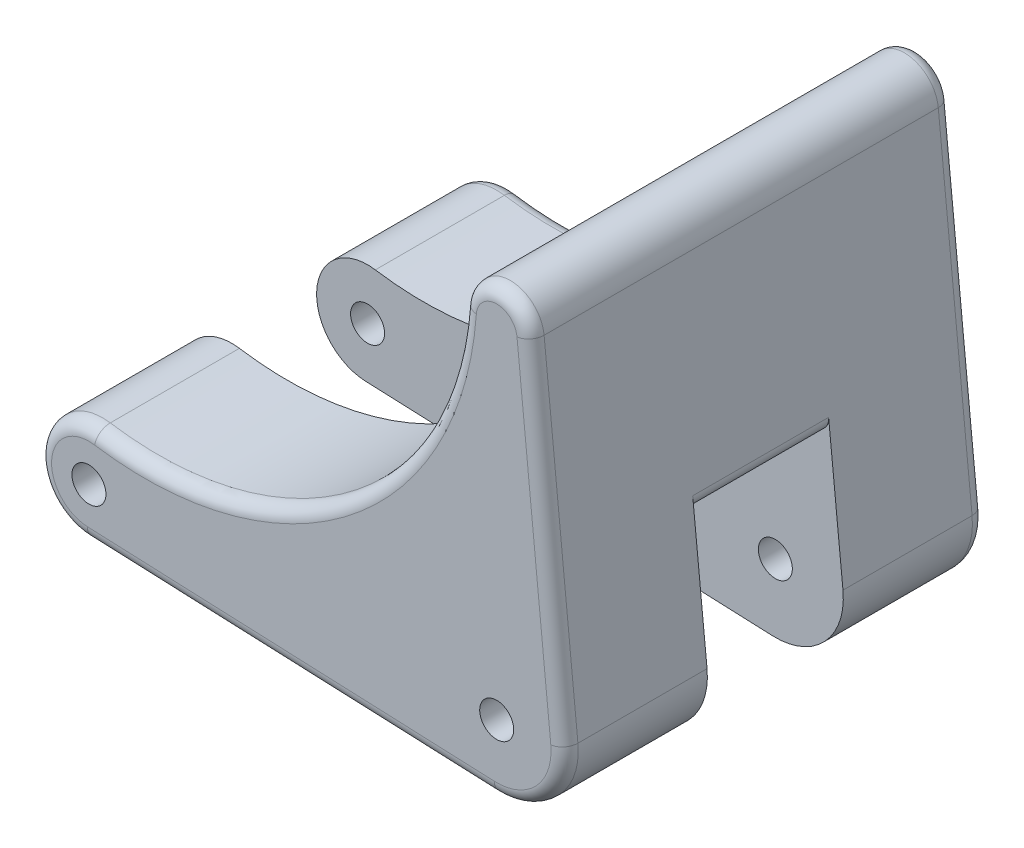
ISO-10303-21;
HEADER;
FILE_DESCRIPTION(('STEP AP214'),'2;1');
FILE_NAME('part.step','',(''),(''),'','','');
FILE_SCHEMA(('AUTOMOTIVE_DESIGN { 1 0 10303 214 1 1 1 1 }'));
ENDSEC;
DATA;
#1=APPLICATION_CONTEXT('core data for automotive mechanical design processes');
#2=APPLICATION_PROTOCOL_DEFINITION('international standard','automotive_design',2000,#1);
#3=PRODUCT_CONTEXT('',#1,'mechanical');
#4=PRODUCT('Part','Part','',(#3));
#5=PRODUCT_RELATED_PRODUCT_CATEGORY('part','',(#4));
#6=PRODUCT_DEFINITION_FORMATION('','',#4);
#7=PRODUCT_DEFINITION_CONTEXT('part definition',#1,'design');
#8=PRODUCT_DEFINITION('design','',#6,#7);
#9=PRODUCT_DEFINITION_SHAPE('','',#8);
#10=(LENGTH_UNIT() NAMED_UNIT(*) SI_UNIT(.MILLI.,.METRE.));
#11=(NAMED_UNIT(*) PLANE_ANGLE_UNIT() SI_UNIT($,.RADIAN.));
#12=(NAMED_UNIT(*) SI_UNIT($,.STERADIAN.) SOLID_ANGLE_UNIT());
#13=UNCERTAINTY_MEASURE_WITH_UNIT(LENGTH_MEASURE(1.E-05),#10,'distance_accuracy_value','');
#14=(GEOMETRIC_REPRESENTATION_CONTEXT(3) GLOBAL_UNCERTAINTY_ASSIGNED_CONTEXT((#13)) GLOBAL_UNIT_ASSIGNED_CONTEXT((#10,
#11,#12)) REPRESENTATION_CONTEXT('',''));
#15=CARTESIAN_POINT('',(0.,0.,0.));
#16=DIRECTION('',(0.,0.,1.));
#17=DIRECTION('',(1.,0.,0.));
#18=AXIS2_PLACEMENT_3D('',#15,#16,#17);
#19=CARTESIAN_POINT('',(0.,0.,39.37));
#20=DIRECTION('',(0.,0.,-1.));
#21=DIRECTION('',(-1.,0.,0.));
#22=AXIS2_PLACEMENT_3D('',#19,#20,#21);
#23=CYLINDRICAL_SURFACE('',#22,12.7);
#24=DIRECTION('',(0.,0.,-1.));
#25=VECTOR('',#24,1.);
#26=CARTESIAN_POINT('',(12.6363404512541,1.27,39.37));
#27=LINE('',#26,#25);
#28=CARTESIAN_POINT('',(12.6363404512541,1.27,36.83));
#29=VERTEX_POINT('',#28);
#30=CARTESIAN_POINT('',(12.6363404512541,1.27000000000001,12.7));
#31=VERTEX_POINT('',#30);
#32=EDGE_CURVE('E221',#29,#31,#27,.T.);
#33=ORIENTED_EDGE('',*,*,#32,.F.);
#34=CARTESIAN_POINT('',(0.,0.,36.83));
#35=DIRECTION('',(0.,0.,1.));
#36=DIRECTION('',(1.,0.,0.));
#37=AXIS2_PLACEMENT_3D('',#34,#35,#36);
#38=CIRCLE('',#37,12.7);
#39=CARTESIAN_POINT('',(-0.529166666666669,-12.6889709054316,36.83));
#40=VERTEX_POINT('',#39);
#41=EDGE_CURVE('E292',#29,#40,#38,.F.);
#42=ORIENTED_EDGE('',*,*,#41,.T.);
#43=DIRECTION('',(0.,0.,-1.));
#44=VECTOR('',#43,1.);
#45=CARTESIAN_POINT('',(-0.529166666666669,-12.6889709054316,39.37));
#46=LINE('',#45,#44);
#47=CARTESIAN_POINT('',(-0.52916666666665,-12.6889709054316,12.7));
#48=VERTEX_POINT('',#47);
#49=EDGE_CURVE('E201',#40,#48,#46,.T.);
#50=ORIENTED_EDGE('',*,*,#49,.T.);
#51=CARTESIAN_POINT('',(0.,0.,12.7));
#52=DIRECTION('',(0.,0.,1.));
#53=DIRECTION('',(1.,0.,0.));
#54=AXIS2_PLACEMENT_3D('',#51,#52,#53);
#55=CIRCLE('',#54,12.7);
#56=EDGE_CURVE('E366',#48,#31,#55,.T.);
#57=ORIENTED_EDGE('',*,*,#56,.T.);
#58=EDGE_LOOP('',(#33,#42,#50,#57));
#59=FACE_BOUND('',#58,.T.);
#60=ADVANCED_FACE('F35',(#59),#23,.T.);
#61=CARTESIAN_POINT('',(-76.2,0.,39.37));
#62=DIRECTION('',(0.,0.,-1.));
#63=DIRECTION('',(-1.,0.,0.));
#64=AXIS2_PLACEMENT_3D('',#61,#62,#63);
#65=CYLINDRICAL_SURFACE('',#64,9.52500000000001);
#66=DIRECTION('',(0.,0.,-1.));
#67=VECTOR('',#66,1.);
#68=CARTESIAN_POINT('',(-76.596875,-9.51672817907368,39.37));
#69=LINE('',#68,#67);
#70=CARTESIAN_POINT('',(-76.596875,-9.51672817907368,36.83));
#71=VERTEX_POINT('',#70);
#72=CARTESIAN_POINT('',(-76.596875,-9.51672817907368,12.7));
#73=VERTEX_POINT('',#72);
#74=EDGE_CURVE('E210',#71,#73,#69,.T.);
#75=ORIENTED_EDGE('',*,*,#74,.F.);
#76=CARTESIAN_POINT('',(-76.2,0.,36.83));
#77=DIRECTION('',(0.,0.,1.));
#78=DIRECTION('',(1.,0.,0.));
#79=AXIS2_PLACEMENT_3D('',#76,#77,#78);
#80=CIRCLE('',#79,9.52500000000001);
#81=CARTESIAN_POINT('',(-74.7540151022709,9.41460316081032,36.83));
#82=VERTEX_POINT('',#81);
#83=EDGE_CURVE('E52',#71,#82,#80,.F.);
#84=ORIENTED_EDGE('',*,*,#83,.T.);
#85=DIRECTION('',(0.,0.,-1.));
#86=VECTOR('',#85,1.);
#87=CARTESIAN_POINT('',(-74.7540151022709,9.41460316081032,39.37));
#88=LINE('',#87,#86);
#89=CARTESIAN_POINT('',(-74.7540151022709,9.41460316081031,12.7));
#90=VERTEX_POINT('',#89);
#91=EDGE_CURVE('E213',#82,#90,#88,.T.);
#92=ORIENTED_EDGE('',*,*,#91,.T.);
#93=CARTESIAN_POINT('',(-76.2,0.,12.7));
#94=DIRECTION('',(0.,0.,1.));
#95=DIRECTION('',(1.,0.,0.));
#96=AXIS2_PLACEMENT_3D('',#93,#94,#95);
#97=CIRCLE('',#96,9.52500000000001);
#98=EDGE_CURVE('E601',#90,#73,#97,.T.);
#99=ORIENTED_EDGE('',*,*,#98,.T.);
#100=EDGE_LOOP('',(#75,#84,#92,#99));
#101=FACE_BOUND('',#100,.T.);
#102=ADVANCED_FACE('F411',(#101),#65,.T.);
#103=CARTESIAN_POINT('',(-76.596875,-9.51672817907368,39.37));
#104=DIRECTION('',(0.0416666666666666,0.999131567356817,0.));
#105=DIRECTION('',(-0.999131567356817,0.0416666666666666,0.));
#106=AXIS2_PLACEMENT_3D('',#103,#104,#105);
#107=PLANE('',#106);
#108=ORIENTED_EDGE('',*,*,#49,.F.);
#109=DIRECTION('',(0.999131567356817,-0.0416666666666666,0.));
#110=VECTOR('',#109,1.);
#111=CARTESIAN_POINT('',(-76.596875,-9.51672817907368,36.83));
#112=LINE('',#111,#110);
#113=EDGE_CURVE('E60',#40,#71,#112,.F.);
#114=ORIENTED_EDGE('',*,*,#113,.T.);
#115=ORIENTED_EDGE('',*,*,#74,.T.);
#116=DIRECTION('',(-0.999131567356817,0.0416666666666666,0.));
#117=VECTOR('',#116,1.);
#118=CARTESIAN_POINT('',(-118.422260597465,-7.77248902496035,12.7));
#119=LINE('',#118,#117);
#120=EDGE_CURVE('E184',#48,#73,#119,.T.);
#121=ORIENTED_EDGE('',*,*,#120,.F.);
#122=EDGE_LOOP('',(#108,#114,#115,#121));
#123=FACE_BOUND('',#122,.T.);
#124=ADVANCED_FACE('F405',(#123),#107,.F.);
#125=CARTESIAN_POINT('',(-76.2,0.,39.37));
#126=DIRECTION('',(0.,0.,-1.));
#127=DIRECTION('',(-1.,0.,0.));
#128=AXIS2_PLACEMENT_3D('',#125,#126,#127);
#129=CYLINDRICAL_SURFACE('',#128,3.175);
#130=CARTESIAN_POINT('',(-76.2,0.,12.7));
#131=DIRECTION('',(0.,0.,1.));
#132=DIRECTION('',(1.,0.,0.));
#133=AXIS2_PLACEMENT_3D('',#130,#131,#132);
#134=CIRCLE('',#133,3.175);
#135=CARTESIAN_POINT('',(-73.025,0.,12.7));
#136=VERTEX_POINT('',#135);
#137=EDGE_CURVE('E231',#136,#136,#134,.T.);
#138=ORIENTED_EDGE('',*,*,#137,.F.);
#139=EDGE_LOOP('',(#138));
#140=FACE_BOUND('',#139,.T.);
#141=CARTESIAN_POINT('',(-76.2,0.,39.37));
#142=DIRECTION('',(0.,0.,1.));
#143=DIRECTION('',(1.,0.,0.));
#144=AXIS2_PLACEMENT_3D('',#141,#142,#143);
#145=CIRCLE('',#144,3.175);
#146=CARTESIAN_POINT('',(-73.025,0.,39.37));
#147=VERTEX_POINT('',#146);
#148=EDGE_CURVE('E202',#147,#147,#145,.T.);
#149=ORIENTED_EDGE('',*,*,#148,.T.);
#150=EDGE_LOOP('',(#149));
#151=FACE_BOUND('',#150,.T.);
#152=ADVANCED_FACE('F394',(#140,#151),#129,.F.);
#153=CARTESIAN_POINT('',(0.,0.,39.37));
#154=DIRECTION('',(0.,0.,-1.));
#155=DIRECTION('',(-1.,0.,0.));
#156=AXIS2_PLACEMENT_3D('',#153,#154,#155);
#157=CYLINDRICAL_SURFACE('',#156,3.175);
#158=CARTESIAN_POINT('',(0.,0.,12.7));
#159=DIRECTION('',(0.,0.,1.));
#160=DIRECTION('',(1.,0.,0.));
#161=AXIS2_PLACEMENT_3D('',#158,#159,#160);
#162=CIRCLE('',#161,3.175);
#163=CARTESIAN_POINT('',(3.175,0.,12.7));
#164=VERTEX_POINT('',#163);
#165=EDGE_CURVE('E195',#164,#164,#162,.T.);
#166=ORIENTED_EDGE('',*,*,#165,.F.);
#167=EDGE_LOOP('',(#166));
#168=FACE_BOUND('',#167,.T.);
#169=CARTESIAN_POINT('',(0.,0.,39.37));
#170=DIRECTION('',(0.,0.,1.));
#171=DIRECTION('',(1.,0.,0.));
#172=AXIS2_PLACEMENT_3D('',#169,#170,#171);
#173=CIRCLE('',#172,3.175);
#174=CARTESIAN_POINT('',(3.175,0.,39.37));
#175=VERTEX_POINT('',#174);
#176=EDGE_CURVE('E374',#175,#175,#173,.T.);
#177=ORIENTED_EDGE('',*,*,#176,.T.);
#178=EDGE_LOOP('',(#177));
#179=FACE_BOUND('',#178,.T.);
#180=ADVANCED_FACE('F402',(#168,#179),#157,.F.);
#181=CARTESIAN_POINT('',(0.,0.,39.37));
#182=DIRECTION('',(0.,0.,1.));
#183=DIRECTION('',(1.,0.,0.));
#184=AXIS2_PLACEMENT_3D('',#181,#182,#183);
#185=PLANE('',#184);
#186=DIRECTION('',(-0.1,0.99498743710662,0.));
#187=VECTOR('',#186,1.);
#188=CARTESIAN_POINT('',(3.79090213537622,63.881,39.37));
#189=LINE('',#188,#187);
#190=CARTESIAN_POINT('',(10.1090723610033,1.016,39.37));
#191=VERTEX_POINT('',#190);
#192=CARTESIAN_POINT('',(3.79090213537622,63.881,39.37));
#193=VERTEX_POINT('',#192);
#194=EDGE_CURVE('E287',#191,#193,#189,.T.);
#195=ORIENTED_EDGE('',*,*,#194,.T.);
#196=CARTESIAN_POINT('',(0.,63.5,39.37));
#197=DIRECTION('',(0.,0.,1.));
#198=DIRECTION('',(1.,0.,0.));
#199=AXIS2_PLACEMENT_3D('',#196,#197,#198);
#200=CIRCLE('',#199,3.80999999999999);
#201=CARTESIAN_POINT('',(-3.80003405017057,63.7753928422168,39.37));
#202=VERTEX_POINT('',#201);
#203=EDGE_CURVE('E289',#193,#202,#200,.T.);
#204=ORIENTED_EDGE('',*,*,#203,.T.);
#205=CARTESIAN_POINT('',(-65.7155939830138,68.2624847477706,39.37));
#206=DIRECTION('',(0.,0.,1.));
#207=DIRECTION('',(1.,0.,0.));
#208=AXIS2_PLACEMENT_3D('',#205,#206,#207);
#209=CIRCLE('',#208,62.0779393630812);
#210=CARTESIAN_POINT('',(-75.1396110749987,6.90404231792755,39.37));
#211=VERTEX_POINT('',#210);
#212=EDGE_CURVE('E279',#202,#211,#209,.F.);
#213=ORIENTED_EDGE('',*,*,#212,.T.);
#214=CARTESIAN_POINT('',(-76.2,0.,39.37));
#215=DIRECTION('',(0.,0.,1.));
#216=DIRECTION('',(1.,0.,0.));
#217=AXIS2_PLACEMENT_3D('',#214,#215,#216);
#218=CIRCLE('',#217,6.985);
#219=CARTESIAN_POINT('',(-76.4910416666667,-6.97893399798737,39.37));
#220=VERTEX_POINT('',#219);
#221=EDGE_CURVE('E281',#211,#220,#218,.T.);
#222=ORIENTED_EDGE('',*,*,#221,.T.);
#223=DIRECTION('',(0.999131567356817,-0.0416666666666666,0.));
#224=VECTOR('',#223,1.);
#225=CARTESIAN_POINT('',(-0.423333333333336,-10.1511767243453,39.37));
#226=LINE('',#225,#224);
#227=CARTESIAN_POINT('',(-0.423333333333336,-10.1511767243453,39.37));
#228=VERTEX_POINT('',#227);
#229=EDGE_CURVE('E283',#220,#228,#226,.T.);
#230=ORIENTED_EDGE('',*,*,#229,.T.);
#231=CARTESIAN_POINT('',(0.,0.,39.37));
#232=DIRECTION('',(0.,0.,1.));
#233=DIRECTION('',(1.,0.,0.));
#234=AXIS2_PLACEMENT_3D('',#231,#232,#233);
#235=CIRCLE('',#234,10.16);
#236=EDGE_CURVE('E285',#228,#191,#235,.T.);
#237=ORIENTED_EDGE('',*,*,#236,.T.);
#238=EDGE_LOOP('',(#195,#204,#213,#222,#230,#237));
#239=FACE_BOUND('',#238,.T.);
#240=ORIENTED_EDGE('',*,*,#148,.F.);
#241=EDGE_LOOP('',(#240));
#242=FACE_BOUND('',#241,.T.);
#243=ORIENTED_EDGE('',*,*,#176,.F.);
#244=EDGE_LOOP('',(#243));
#245=FACE_BOUND('',#244,.T.);
#246=ADVANCED_FACE('F424',(#239,#242,#245),#185,.T.);
#247=CARTESIAN_POINT('',(0.,0.,-39.37));
#248=DIRECTION('',(0.,0.,1.));
#249=DIRECTION('',(1.,0.,0.));
#250=AXIS2_PLACEMENT_3D('',#247,#248,#249);
#251=PLANE('',#250);
#252=CARTESIAN_POINT('',(-65.7155939830138,68.2624847477706,-39.37));
#253=DIRECTION('',(0.,0.,1.));
#254=DIRECTION('',(1.,0.,0.));
#255=AXIS2_PLACEMENT_3D('',#252,#253,#254);
#256=CIRCLE('',#255,62.0779393630812);
#257=CARTESIAN_POINT('',(-75.1396110749987,6.90404231792755,-39.37));
#258=VERTEX_POINT('',#257);
#259=CARTESIAN_POINT('',(-3.80003405017057,63.7753928422168,-39.37));
#260=VERTEX_POINT('',#259);
#261=EDGE_CURVE('E257',#258,#260,#256,.T.);
#262=ORIENTED_EDGE('',*,*,#261,.T.);
#263=CARTESIAN_POINT('',(0.,63.5,-39.37));
#264=DIRECTION('',(0.,0.,1.));
#265=DIRECTION('',(1.,0.,0.));
#266=AXIS2_PLACEMENT_3D('',#263,#264,#265);
#267=CIRCLE('',#266,3.80999999999999);
#268=CARTESIAN_POINT('',(3.79090213537622,63.881,-39.37));
#269=VERTEX_POINT('',#268);
#270=EDGE_CURVE('E267',#260,#269,#267,.F.);
#271=ORIENTED_EDGE('',*,*,#270,.T.);
#272=DIRECTION('',(-0.1,0.99498743710662,0.));
#273=VECTOR('',#272,1.);
#274=CARTESIAN_POINT('',(10.1090723610033,1.016,-39.37));
#275=LINE('',#274,#273);
#276=CARTESIAN_POINT('',(10.1090723610033,1.016,-39.37));
#277=VERTEX_POINT('',#276);
#278=EDGE_CURVE('E265',#269,#277,#275,.F.);
#279=ORIENTED_EDGE('',*,*,#278,.T.);
#280=CARTESIAN_POINT('',(0.,0.,-39.37));
#281=DIRECTION('',(0.,0.,1.));
#282=DIRECTION('',(1.,0.,0.));
#283=AXIS2_PLACEMENT_3D('',#280,#281,#282);
#284=CIRCLE('',#283,10.16);
#285=CARTESIAN_POINT('',(-0.423333333333336,-10.1511767243453,-39.37));
#286=VERTEX_POINT('',#285);
#287=EDGE_CURVE('E263',#277,#286,#284,.F.);
#288=ORIENTED_EDGE('',*,*,#287,.T.);
#289=DIRECTION('',(0.999131567356817,-0.0416666666666666,0.));
#290=VECTOR('',#289,1.);
#291=CARTESIAN_POINT('',(-0.423333333333333,-10.1511767243453,-39.37));
#292=LINE('',#291,#290);
#293=CARTESIAN_POINT('',(-76.4910416666667,-6.97893399798737,-39.37));
#294=VERTEX_POINT('',#293);
#295=EDGE_CURVE('E261',#286,#294,#292,.F.);
#296=ORIENTED_EDGE('',*,*,#295,.T.);
#297=CARTESIAN_POINT('',(-76.2,0.,-39.37));
#298=DIRECTION('',(0.,0.,1.));
#299=DIRECTION('',(1.,0.,0.));
#300=AXIS2_PLACEMENT_3D('',#297,#298,#299);
#301=CIRCLE('',#300,6.985);
#302=EDGE_CURVE('E259',#294,#258,#301,.F.);
#303=ORIENTED_EDGE('',*,*,#302,.T.);
#304=EDGE_LOOP('',(#262,#271,#279,#288,#296,#303));
#305=FACE_BOUND('',#304,.T.);
#306=CARTESIAN_POINT('',(-76.2,0.,-39.37));
#307=DIRECTION('',(0.,0.,1.));
#308=DIRECTION('',(1.,0.,0.));
#309=AXIS2_PLACEMENT_3D('',#306,#307,#308);
#310=CIRCLE('',#309,3.175);
#311=CARTESIAN_POINT('',(-73.025,0.,-39.37));
#312=VERTEX_POINT('',#311);
#313=EDGE_CURVE('E206',#312,#312,#310,.T.);
#314=ORIENTED_EDGE('',*,*,#313,.T.);
#315=EDGE_LOOP('',(#314));
#316=FACE_BOUND('',#315,.T.);
#317=CARTESIAN_POINT('',(0.,0.,-39.37));
#318=DIRECTION('',(0.,0.,1.));
#319=DIRECTION('',(1.,0.,0.));
#320=AXIS2_PLACEMENT_3D('',#317,#318,#319);
#321=CIRCLE('',#320,3.175);
#322=CARTESIAN_POINT('',(3.175,0.,-39.37));
#323=VERTEX_POINT('',#322);
#324=EDGE_CURVE('E370',#323,#323,#321,.T.);
#325=ORIENTED_EDGE('',*,*,#324,.T.);
#326=EDGE_LOOP('',(#325));
#327=FACE_BOUND('',#326,.T.);
#328=ADVANCED_FACE('F386',(#305,#316,#327),#251,.F.);
#329=CARTESIAN_POINT('',(-0.52916666666665,-12.6889709054316,-12.7));
#330=VERTEX_POINT('',#329);
#331=CARTESIAN_POINT('',(-0.529166666666669,-12.6889709054316,-36.83));
#332=VERTEX_POINT('',#331);
#333=EDGE_CURVE('E191',#330,#332,#46,.T.);
#334=ORIENTED_EDGE('',*,*,#333,.T.);
#335=CARTESIAN_POINT('',(0.,0.,-36.83));
#336=DIRECTION('',(0.,0.,1.));
#337=DIRECTION('',(1.,0.,0.));
#338=AXIS2_PLACEMENT_3D('',#335,#336,#337);
#339=CIRCLE('',#338,12.7);
#340=CARTESIAN_POINT('',(12.6363404512541,1.27,-36.83));
#341=VERTEX_POINT('',#340);
#342=EDGE_CURVE('E274',#332,#341,#339,.T.);
#343=ORIENTED_EDGE('',*,*,#342,.T.);
#344=CARTESIAN_POINT('',(12.6363404512541,1.27000000000001,-12.7));
#345=VERTEX_POINT('',#344);
#346=EDGE_CURVE('E194',#345,#341,#27,.T.);
#347=ORIENTED_EDGE('',*,*,#346,.F.);
#348=CARTESIAN_POINT('',(0.,0.,-12.7));
#349=DIRECTION('',(0.,0.,-1.));
#350=DIRECTION('',(-1.,0.,0.));
#351=AXIS2_PLACEMENT_3D('',#348,#349,#350);
#352=CIRCLE('',#351,12.7);
#353=EDGE_CURVE('E176',#345,#330,#352,.T.);
#354=ORIENTED_EDGE('',*,*,#353,.T.);
#355=EDGE_LOOP('',(#334,#343,#347,#354));
#356=FACE_BOUND('',#355,.T.);
#357=ADVANCED_FACE('F190',(#356),#23,.T.);
#358=CARTESIAN_POINT('',(6.31817022562704,64.135,39.37));
#359=DIRECTION('',(-0.99498743710662,-0.1,0.));
#360=DIRECTION('',(0.1,-0.99498743710662,0.));
#361=AXIS2_PLACEMENT_3D('',#358,#359,#360);
#362=PLANE('',#361);
#363=ORIENTED_EDGE('',*,*,#346,.T.);
#364=DIRECTION('',(-0.1,0.99498743710662,0.));
#365=VECTOR('',#364,1.);
#366=CARTESIAN_POINT('',(6.31817022562704,64.135,-36.83));
#367=LINE('',#366,#365);
#368=CARTESIAN_POINT('',(6.31817022562703,64.135,-36.83));
#369=VERTEX_POINT('',#368);
#370=EDGE_CURVE('E272',#341,#369,#367,.T.);
#371=ORIENTED_EDGE('',*,*,#370,.T.);
#372=DIRECTION('',(0.,0.,-1.));
#373=VECTOR('',#372,1.);
#374=CARTESIAN_POINT('',(6.31817022562703,64.135,39.37));
#375=LINE('',#374,#373);
#376=CARTESIAN_POINT('',(6.31817022562703,64.135,36.83));
#377=VERTEX_POINT('',#376);
#378=EDGE_CURVE('E218',#377,#369,#375,.T.);
#379=ORIENTED_EDGE('',*,*,#378,.F.);
#380=DIRECTION('',(-0.1,0.99498743710662,0.));
#381=VECTOR('',#380,1.);
#382=CARTESIAN_POINT('',(12.6363404512541,1.27,36.83));
#383=LINE('',#382,#381);
#384=EDGE_CURVE('E270',#377,#29,#383,.F.);
#385=ORIENTED_EDGE('',*,*,#384,.T.);
#386=ORIENTED_EDGE('',*,*,#32,.T.);
#387=DIRECTION('',(-0.1,0.99498743710662,0.));
#388=VECTOR('',#387,1.);
#389=CARTESIAN_POINT('',(6.31817022562704,64.135,12.7));
#390=LINE('',#389,#388);
#391=CARTESIAN_POINT('',(9.95908484768844,27.9083569147111,12.7));
#392=VERTEX_POINT('',#391);
#393=EDGE_CURVE('E371',#31,#392,#390,.T.);
#394=ORIENTED_EDGE('',*,*,#393,.T.);
#395=DIRECTION('',(0.,0.,-1.));
#396=VECTOR('',#395,1.);
#397=CARTESIAN_POINT('',(9.95908484768844,27.9083569147111,39.37));
#398=LINE('',#397,#396);
#399=CARTESIAN_POINT('',(9.95908484768844,27.9083569147111,-12.7));
#400=VERTEX_POINT('',#399);
#401=EDGE_CURVE('E238',#392,#400,#398,.T.);
#402=ORIENTED_EDGE('',*,*,#401,.T.);
#403=DIRECTION('',(0.1,-0.99498743710662,0.));
#404=VECTOR('',#403,1.);
#405=CARTESIAN_POINT('',(6.31817022562704,64.135,-12.7));
#406=LINE('',#405,#404);
#407=EDGE_CURVE('E196',#400,#345,#406,.T.);
#408=ORIENTED_EDGE('',*,*,#407,.T.);
#409=EDGE_LOOP('',(#363,#371,#379,#385,#386,#394,#402,#408));
#410=FACE_BOUND('',#409,.T.);
#411=ADVANCED_FACE('F361',(#410),#362,.F.);
#412=CARTESIAN_POINT('',(0.,63.5,39.37));
#413=DIRECTION('',(0.,0.,-1.));
#414=DIRECTION('',(-1.,0.,0.));
#415=AXIS2_PLACEMENT_3D('',#412,#413,#414);
#416=CYLINDRICAL_SURFACE('',#415,6.34999999999999);
#417=ORIENTED_EDGE('',*,*,#378,.T.);
#418=CARTESIAN_POINT('',(0.,63.5,-36.83));
#419=DIRECTION('',(0.,0.,1.));
#420=DIRECTION('',(1.,0.,0.));
#421=AXIS2_PLACEMENT_3D('',#418,#419,#420);
#422=CIRCLE('',#421,6.34999999999999);
#423=CARTESIAN_POINT('',(-6.33339008361763,63.9589880703613,-36.83));
#424=VERTEX_POINT('',#423);
#425=EDGE_CURVE('E254',#369,#424,#422,.T.);
#426=ORIENTED_EDGE('',*,*,#425,.T.);
#427=DIRECTION('',(0.,0.,-1.));
#428=VECTOR('',#427,1.);
#429=CARTESIAN_POINT('',(-6.33339008361763,63.9589880703613,39.37));
#430=LINE('',#429,#428);
#431=CARTESIAN_POINT('',(-6.33339008361763,63.9589880703613,36.83));
#432=VERTEX_POINT('',#431);
#433=EDGE_CURVE('E215',#432,#424,#430,.T.);
#434=ORIENTED_EDGE('',*,*,#433,.F.);
#435=CARTESIAN_POINT('',(0.,63.5,36.83));
#436=DIRECTION('',(0.,0.,1.));
#437=DIRECTION('',(1.,0.,0.));
#438=AXIS2_PLACEMENT_3D('',#435,#436,#437);
#439=CIRCLE('',#438,6.34999999999999);
#440=EDGE_CURVE('E251',#432,#377,#439,.F.);
#441=ORIENTED_EDGE('',*,*,#440,.T.);
#442=EDGE_LOOP('',(#417,#426,#434,#441));
#443=FACE_BOUND('',#442,.T.);
#444=ADVANCED_FACE('F348',(#443),#416,.T.);
#445=CARTESIAN_POINT('',(-65.7155939830138,68.2624847477706,39.37));
#446=DIRECTION('',(0.,0.,-1.));
#447=DIRECTION('',(-1.,0.,0.));
#448=AXIS2_PLACEMENT_3D('',#445,#446,#447);
#449=CYLINDRICAL_SURFACE('',#448,59.5379393630813);
#450=ORIENTED_EDGE('',*,*,#433,.T.);
#451=CARTESIAN_POINT('',(-65.7155939830138,68.2624847477706,-36.83));
#452=DIRECTION('',(0.,0.,1.));
#453=DIRECTION('',(1.,0.,0.));
#454=AXIS2_PLACEMENT_3D('',#451,#452,#453);
#455=CIRCLE('',#454,59.5379393630813);
#456=CARTESIAN_POINT('',(-74.7540151022709,9.41460316081032,-36.83));
#457=VERTEX_POINT('',#456);
#458=EDGE_CURVE('E11',#424,#457,#455,.F.);
#459=ORIENTED_EDGE('',*,*,#458,.T.);
#460=CARTESIAN_POINT('',(-74.7540151022709,9.41460316081031,-12.7));
#461=VERTEX_POINT('',#460);
#462=EDGE_CURVE('E212',#461,#457,#88,.T.);
#463=ORIENTED_EDGE('',*,*,#462,.F.);
#464=CARTESIAN_POINT('',(-65.7155939830138,68.2624847477706,-12.7));
#465=DIRECTION('',(0.,0.,-1.));
#466=DIRECTION('',(-1.,0.,0.));
#467=AXIS2_PLACEMENT_3D('',#464,#465,#466);
#468=CIRCLE('',#467,59.5379393630813);
#469=CARTESIAN_POINT('',(-19.8273518104615,30.3278639652305,-12.7));
#470=VERTEX_POINT('',#469);
#471=EDGE_CURVE('E583',#461,#470,#468,.F.);
#472=ORIENTED_EDGE('',*,*,#471,.T.);
#473=DIRECTION('',(0.,0.,-1.));
#474=VECTOR('',#473,1.);
#475=CARTESIAN_POINT('',(-19.8273518104615,30.3278639652305,39.37));
#476=LINE('',#475,#474);
#477=CARTESIAN_POINT('',(-19.8273518104615,30.3278639652305,12.7));
#478=VERTEX_POINT('',#477);
#479=EDGE_CURVE('E223',#470,#478,#476,.F.);
#480=ORIENTED_EDGE('',*,*,#479,.T.);
#481=CARTESIAN_POINT('',(-65.7155939830138,68.2624847477706,12.7));
#482=DIRECTION('',(0.,0.,1.));
#483=DIRECTION('',(1.,0.,0.));
#484=AXIS2_PLACEMENT_3D('',#481,#482,#483);
#485=CIRCLE('',#484,59.5379393630813);
#486=EDGE_CURVE('E376',#478,#90,#485,.F.);
#487=ORIENTED_EDGE('',*,*,#486,.T.);
#488=ORIENTED_EDGE('',*,*,#91,.F.);
#489=CARTESIAN_POINT('',(-65.7155939830138,68.2624847477706,36.83));
#490=DIRECTION('',(0.,0.,1.));
#491=DIRECTION('',(1.,0.,0.));
#492=AXIS2_PLACEMENT_3D('',#489,#490,#491);
#493=CIRCLE('',#492,59.5379393630813);
#494=EDGE_CURVE('E44',#82,#432,#493,.T.);
#495=ORIENTED_EDGE('',*,*,#494,.T.);
#496=EDGE_LOOP('',(#450,#459,#463,#472,#480,#487,#488,#495));
#497=FACE_BOUND('',#496,.T.);
#498=ADVANCED_FACE('F344',(#497),#449,.F.);
#499=ORIENTED_EDGE('',*,*,#462,.T.);
#500=CARTESIAN_POINT('',(-76.2,0.,-36.83));
#501=DIRECTION('',(0.,0.,1.));
#502=DIRECTION('',(1.,0.,0.));
#503=AXIS2_PLACEMENT_3D('',#500,#501,#502);
#504=CIRCLE('',#503,9.52500000000001);
#505=CARTESIAN_POINT('',(-76.596875,-9.51672817907368,-36.83));
#506=VERTEX_POINT('',#505);
#507=EDGE_CURVE('E277',#457,#506,#504,.T.);
#508=ORIENTED_EDGE('',*,*,#507,.T.);
#509=CARTESIAN_POINT('',(-76.596875,-9.51672817907368,-12.7));
#510=VERTEX_POINT('',#509);
#511=EDGE_CURVE('E204',#510,#506,#69,.T.);
#512=ORIENTED_EDGE('',*,*,#511,.F.);
#513=CARTESIAN_POINT('',(-76.2,0.,-12.7));
#514=DIRECTION('',(0.,0.,-1.));
#515=DIRECTION('',(-1.,0.,0.));
#516=AXIS2_PLACEMENT_3D('',#513,#514,#515);
#517=CIRCLE('',#516,9.52500000000001);
#518=EDGE_CURVE('E179',#510,#461,#517,.T.);
#519=ORIENTED_EDGE('',*,*,#518,.T.);
#520=EDGE_LOOP('',(#499,#508,#512,#519));
#521=FACE_BOUND('',#520,.T.);
#522=ADVANCED_FACE('F403',(#521),#65,.T.);
#523=ORIENTED_EDGE('',*,*,#511,.T.);
#524=DIRECTION('',(0.999131567356817,-0.0416666666666666,0.));
#525=VECTOR('',#524,1.);
#526=CARTESIAN_POINT('',(-76.596875,-9.51672817907368,-36.83));
#527=LINE('',#526,#525);
#528=EDGE_CURVE('E200',#506,#332,#527,.T.);
#529=ORIENTED_EDGE('',*,*,#528,.T.);
#530=ORIENTED_EDGE('',*,*,#333,.F.);
#531=DIRECTION('',(0.999131567356817,-0.0416666666666666,0.));
#532=VECTOR('',#531,1.);
#533=CARTESIAN_POINT('',(-118.422260597465,-7.77248902496035,-12.7));
#534=LINE('',#533,#532);
#535=EDGE_CURVE('E173',#510,#330,#534,.T.);
#536=ORIENTED_EDGE('',*,*,#535,.F.);
#537=EDGE_LOOP('',(#523,#529,#530,#536));
#538=FACE_BOUND('',#537,.T.);
#539=ADVANCED_FACE('F198',(#538),#107,.F.);
#540=CARTESIAN_POINT('',(-76.2,0.,-12.7));
#541=DIRECTION('',(0.,0.,-1.));
#542=DIRECTION('',(-1.,0.,0.));
#543=AXIS2_PLACEMENT_3D('',#540,#541,#542);
#544=CIRCLE('',#543,3.175);
#545=CARTESIAN_POINT('',(-79.375,0.,-12.7));
#546=VERTEX_POINT('',#545);
#547=EDGE_CURVE('E227',#546,#546,#544,.T.);
#548=ORIENTED_EDGE('',*,*,#547,.F.);
#549=EDGE_LOOP('',(#548));
#550=FACE_BOUND('',#549,.T.);
#551=ORIENTED_EDGE('',*,*,#313,.F.);
#552=EDGE_LOOP('',(#551));
#553=FACE_BOUND('',#552,.T.);
#554=ADVANCED_FACE('F389',(#550,#553),#129,.F.);
#555=CARTESIAN_POINT('',(0.,0.,-12.7));
#556=DIRECTION('',(0.,0.,-1.));
#557=DIRECTION('',(-1.,0.,0.));
#558=AXIS2_PLACEMENT_3D('',#555,#556,#557);
#559=CIRCLE('',#558,3.175);
#560=CARTESIAN_POINT('',(-3.175,0.,-12.7));
#561=VERTEX_POINT('',#560);
#562=EDGE_CURVE('E224',#561,#561,#559,.T.);
#563=ORIENTED_EDGE('',*,*,#562,.F.);
#564=EDGE_LOOP('',(#563));
#565=FACE_BOUND('',#564,.T.);
#566=ORIENTED_EDGE('',*,*,#324,.F.);
#567=EDGE_LOOP('',(#566));
#568=FACE_BOUND('',#567,.T.);
#569=ADVANCED_FACE('F391',(#565,#568),#157,.F.);
#570=CARTESIAN_POINT('',(1.05833333333333,25.3779418108631,0.));
#571=DIRECTION('',(0.0416666666666666,0.999131567356817,0.));
#572=DIRECTION('',(-0.999131567356817,0.0416666666666666,0.));
#573=AXIS2_PLACEMENT_3D('',#570,#571,#572);
#574=PLANE('',#573);
#575=DIRECTION('',(-0.999131567356817,0.0416666666666666,0.));
#576=VECTOR('',#575,1.);
#577=CARTESIAN_POINT('',(-116.834760597465,30.2944236913344,12.7));
#578=LINE('',#577,#576);
#579=CARTESIAN_POINT('',(7.32598342410432,25.1165627336248,12.7));
#580=VERTEX_POINT('',#579);
#581=CARTESIAN_POINT('',(-17.9755067900398,26.1717078149794,12.7));
#582=VERTEX_POINT('',#581);
#583=EDGE_CURVE('E228',#580,#582,#578,.T.);
#584=ORIENTED_EDGE('',*,*,#583,.T.);
#585=DIRECTION('',(0.,0.,-1.));
#586=VECTOR('',#585,1.);
#587=CARTESIAN_POINT('',(-17.9755067900398,26.1717078149794,0.));
#588=LINE('',#587,#586);
#589=CARTESIAN_POINT('',(-17.9755067900398,26.1717078149794,-12.7));
#590=VERTEX_POINT('',#589);
#591=EDGE_CURVE('E236',#582,#590,#588,.T.);
#592=ORIENTED_EDGE('',*,*,#591,.T.);
#593=DIRECTION('',(0.999131567356817,-0.0416666666666666,0.));
#594=VECTOR('',#593,1.);
#595=CARTESIAN_POINT('',(-116.834760597465,30.2944236913344,-12.7));
#596=LINE('',#595,#594);
#597=CARTESIAN_POINT('',(7.32598342410432,25.1165627336248,-12.7));
#598=VERTEX_POINT('',#597);
#599=EDGE_CURVE('E585',#590,#598,#596,.T.);
#600=ORIENTED_EDGE('',*,*,#599,.T.);
#601=DIRECTION('',(0.,0.,-1.));
#602=VECTOR('',#601,1.);
#603=CARTESIAN_POINT('',(7.32598342410429,25.1165627336248,0.));
#604=LINE('',#603,#602);
#605=EDGE_CURVE('E234',#598,#580,#604,.F.);
#606=ORIENTED_EDGE('',*,*,#605,.T.);
#607=EDGE_LOOP('',(#584,#592,#600,#606));
#608=FACE_BOUND('',#607,.T.);
#609=ADVANCED_FACE('F399',(#608),#574,.F.);
#610=CARTESIAN_POINT('',(-116.834760597465,30.2944236913344,12.7));
#611=DIRECTION('',(0.,0.,1.));
#612=DIRECTION('',(1.,0.,0.));
#613=AXIS2_PLACEMENT_3D('',#610,#611,#612);
#614=PLANE('',#613);
#615=ORIENTED_EDGE('',*,*,#137,.T.);
#616=EDGE_LOOP('',(#615));
#617=FACE_BOUND('',#616,.T.);
#618=ORIENTED_EDGE('',*,*,#165,.T.);
#619=EDGE_LOOP('',(#618));
#620=FACE_BOUND('',#619,.T.);
#621=ORIENTED_EDGE('',*,*,#120,.T.);
#622=ORIENTED_EDGE('',*,*,#98,.F.);
#623=ORIENTED_EDGE('',*,*,#486,.F.);
#624=CARTESIAN_POINT('',(-17.8696734567065,28.7095019960657,12.7));
#625=DIRECTION('',(0.,0.,1.));
#626=DIRECTION('',(1.,0.,0.));
#627=AXIS2_PLACEMENT_3D('',#624,#625,#626);
#628=CIRCLE('',#627,2.54);
#629=EDGE_CURVE('E241',#478,#582,#628,.T.);
#630=ORIENTED_EDGE('',*,*,#629,.T.);
#631=ORIENTED_EDGE('',*,*,#583,.F.);
#632=CARTESIAN_POINT('',(7.43181675743762,27.6543569147111,12.7));
#633=DIRECTION('',(0.,0.,1.));
#634=DIRECTION('',(1.,0.,0.));
#635=AXIS2_PLACEMENT_3D('',#632,#633,#634);
#636=CIRCLE('',#635,2.54);
#637=EDGE_CURVE('E248',#580,#392,#636,.T.);
#638=ORIENTED_EDGE('',*,*,#637,.T.);
#639=ORIENTED_EDGE('',*,*,#393,.F.);
#640=ORIENTED_EDGE('',*,*,#56,.F.);
#641=EDGE_LOOP('',(#621,#622,#623,#630,#631,#638,#639,#640));
#642=FACE_BOUND('',#641,.T.);
#643=ADVANCED_FACE('F575',(#617,#620,#642),#614,.F.);
#644=CARTESIAN_POINT('',(-116.834760597465,30.2944236913344,-12.7));
#645=DIRECTION('',(0.,0.,-1.));
#646=DIRECTION('',(-1.,0.,0.));
#647=AXIS2_PLACEMENT_3D('',#644,#645,#646);
#648=PLANE('',#647);
#649=ORIENTED_EDGE('',*,*,#547,.T.);
#650=EDGE_LOOP('',(#649));
#651=FACE_BOUND('',#650,.T.);
#652=ORIENTED_EDGE('',*,*,#562,.T.);
#653=EDGE_LOOP('',(#652));
#654=FACE_BOUND('',#653,.T.);
#655=ORIENTED_EDGE('',*,*,#407,.F.);
#656=CARTESIAN_POINT('',(7.43181675743762,27.6543569147111,-12.7));
#657=DIRECTION('',(0.,0.,-1.));
#658=DIRECTION('',(-1.,0.,0.));
#659=AXIS2_PLACEMENT_3D('',#656,#657,#658);
#660=CIRCLE('',#659,2.54);
#661=EDGE_CURVE('E246',#400,#598,#660,.T.);
#662=ORIENTED_EDGE('',*,*,#661,.T.);
#663=ORIENTED_EDGE('',*,*,#599,.F.);
#664=CARTESIAN_POINT('',(-17.8696734567065,28.7095019960657,-12.7));
#665=DIRECTION('',(0.,0.,-1.));
#666=DIRECTION('',(-1.,0.,0.));
#667=AXIS2_PLACEMENT_3D('',#664,#665,#666);
#668=CIRCLE('',#667,2.54);
#669=EDGE_CURVE('E243',#590,#470,#668,.T.);
#670=ORIENTED_EDGE('',*,*,#669,.T.);
#671=ORIENTED_EDGE('',*,*,#471,.F.);
#672=ORIENTED_EDGE('',*,*,#518,.F.);
#673=ORIENTED_EDGE('',*,*,#535,.T.);
#674=ORIENTED_EDGE('',*,*,#353,.F.);
#675=EDGE_LOOP('',(#655,#662,#663,#670,#671,#672,#673,#674));
#676=FACE_BOUND('',#675,.T.);
#677=ADVANCED_FACE('F175',(#651,#654,#676),#648,.F.);
#678=CARTESIAN_POINT('',(-17.8696734567065,28.7095019960657,39.37));
#679=DIRECTION('',(0.,0.,-1.));
#680=DIRECTION('',(-1.,0.,0.));
#681=AXIS2_PLACEMENT_3D('',#678,#679,#680);
#682=CYLINDRICAL_SURFACE('',#681,2.54);
#683=ORIENTED_EDGE('',*,*,#669,.F.);
#684=ORIENTED_EDGE('',*,*,#591,.F.);
#685=ORIENTED_EDGE('',*,*,#629,.F.);
#686=ORIENTED_EDGE('',*,*,#479,.F.);
#687=EDGE_LOOP('',(#683,#684,#685,#686));
#688=FACE_BOUND('',#687,.T.);
#689=ADVANCED_FACE('F568',(#688),#682,.T.);
#690=CARTESIAN_POINT('',(7.43181675743762,27.6543569147111,39.37));
#691=DIRECTION('',(0.,0.,-1.));
#692=DIRECTION('',(-1.,0.,0.));
#693=AXIS2_PLACEMENT_3D('',#690,#691,#692);
#694=CYLINDRICAL_SURFACE('',#693,2.54);
#695=ORIENTED_EDGE('',*,*,#637,.F.);
#696=ORIENTED_EDGE('',*,*,#605,.F.);
#697=ORIENTED_EDGE('',*,*,#661,.F.);
#698=ORIENTED_EDGE('',*,*,#401,.F.);
#699=EDGE_LOOP('',(#695,#696,#697,#698));
#700=FACE_BOUND('',#699,.T.);
#701=ADVANCED_FACE('F465',(#700),#694,.T.);
#702=CARTESIAN_POINT('',(-76.4910416666667,-6.97893399798737,-36.83));
#703=DIRECTION('',(0.999131567356817,-0.0416666666666666,0.));
#704=DIRECTION('',(0.0416666666666666,0.999131567356817,0.));
#705=AXIS2_PLACEMENT_3D('',#702,#703,#704);
#706=CYLINDRICAL_SURFACE('',#705,2.54);
#707=CARTESIAN_POINT('',(-76.4910416666667,-6.97893399798737,-36.83));
#708=DIRECTION('',(-0.999131567356817,0.0416666666666665,0.));
#709=DIRECTION('',(-0.0416666666666665,-0.999131567356817,0.));
#710=AXIS2_PLACEMENT_3D('',#707,#708,#709);
#711=CIRCLE('',#710,2.54);
#712=EDGE_CURVE('E307',#294,#506,#711,.T.);
#713=ORIENTED_EDGE('',*,*,#712,.F.);
#714=ORIENTED_EDGE('',*,*,#295,.F.);
#715=CARTESIAN_POINT('',(-0.423333333333336,-10.1511767243453,-36.83));
#716=DIRECTION('',(0.999131567356817,-0.0416666666666667,0.));
#717=DIRECTION('',(0.0416666666666667,0.999131567356817,0.));
#718=AXIS2_PLACEMENT_3D('',#715,#716,#717);
#719=CIRCLE('',#718,2.54);
#720=EDGE_CURVE('E185',#332,#286,#719,.T.);
#721=ORIENTED_EDGE('',*,*,#720,.F.);
#722=ORIENTED_EDGE('',*,*,#528,.F.);
#723=EDGE_LOOP('',(#713,#714,#721,#722));
#724=FACE_BOUND('',#723,.T.);
#725=ADVANCED_FACE('F459',(#724),#706,.T.);
#726=CARTESIAN_POINT('',(0.,0.,-36.83));
#727=DIRECTION('',(0.,0.,1.));
#728=DIRECTION('',(1.,0.,0.));
#729=AXIS2_PLACEMENT_3D('',#726,#727,#728);
#730=TOROIDAL_SURFACE('',#729,10.16,2.54);
#731=ORIENTED_EDGE('',*,*,#720,.T.);
#732=ORIENTED_EDGE('',*,*,#287,.F.);
#733=CARTESIAN_POINT('',(10.1090723610033,1.016,-36.83));
#734=DIRECTION('',(-0.1,0.99498743710662,0.));
#735=DIRECTION('',(-0.99498743710662,-0.1,0.));
#736=AXIS2_PLACEMENT_3D('',#733,#734,#735);
#737=CIRCLE('',#736,2.54);
#738=EDGE_CURVE('E304',#341,#277,#737,.T.);
#739=ORIENTED_EDGE('',*,*,#738,.F.);
#740=ORIENTED_EDGE('',*,*,#342,.F.);
#741=EDGE_LOOP('',(#731,#732,#739,#740));
#742=FACE_BOUND('',#741,.T.);
#743=ADVANCED_FACE('F464',(#742),#730,.T.);
#744=CARTESIAN_POINT('',(-76.2,0.,-36.83));
#745=DIRECTION('',(0.,0.,1.));
#746=DIRECTION('',(1.,0.,0.));
#747=AXIS2_PLACEMENT_3D('',#744,#745,#746);
#748=TOROIDAL_SURFACE('',#747,6.985,2.54);
#749=ORIENTED_EDGE('',*,*,#712,.T.);
#750=ORIENTED_EDGE('',*,*,#507,.F.);
#751=CARTESIAN_POINT('',(-75.1396110749987,6.90404231792756,-36.83));
#752=DIRECTION('',(0.9884097806625,-0.151809438081791,0.));
#753=DIRECTION('',(0.151809438081791,0.9884097806625,0.));
#754=AXIS2_PLACEMENT_3D('',#751,#752,#753);
#755=CIRCLE('',#754,2.54);
#756=EDGE_CURVE('E301',#258,#457,#755,.T.);
#757=ORIENTED_EDGE('',*,*,#756,.F.);
#758=ORIENTED_EDGE('',*,*,#302,.F.);
#759=EDGE_LOOP('',(#749,#750,#757,#758));
#760=FACE_BOUND('',#759,.T.);
#761=ADVANCED_FACE('F477',(#760),#748,.T.);
#762=CARTESIAN_POINT('',(3.79090213537622,63.881,-36.83));
#763=DIRECTION('',(-0.1,0.99498743710662,0.));
#764=DIRECTION('',(-0.99498743710662,-0.1,0.));
#765=AXIS2_PLACEMENT_3D('',#762,#763,#764);
#766=CYLINDRICAL_SURFACE('',#765,2.54);
#767=ORIENTED_EDGE('',*,*,#738,.T.);
#768=ORIENTED_EDGE('',*,*,#278,.F.);
#769=CARTESIAN_POINT('',(3.79090213537622,63.881,-36.83));
#770=DIRECTION('',(-0.100000000000002,0.99498743710662,0.));
#771=DIRECTION('',(-0.99498743710662,-0.100000000000002,0.));
#772=AXIS2_PLACEMENT_3D('',#769,#770,#771);
#773=CIRCLE('',#772,2.54);
#774=EDGE_CURVE('E299',#369,#269,#773,.T.);
#775=ORIENTED_EDGE('',*,*,#774,.F.);
#776=ORIENTED_EDGE('',*,*,#370,.F.);
#777=EDGE_LOOP('',(#767,#768,#775,#776));
#778=FACE_BOUND('',#777,.T.);
#779=ADVANCED_FACE('F487',(#778),#766,.T.);
#780=CARTESIAN_POINT('',(-65.7155939830138,68.2624847477706,-36.83));
#781=DIRECTION('',(0.,0.,1.));
#782=DIRECTION('',(1.,0.,0.));
#783=AXIS2_PLACEMENT_3D('',#780,#781,#782);
#784=TOROIDAL_SURFACE('',#783,62.0779393630812,2.54);
#785=ORIENTED_EDGE('',*,*,#756,.T.);
#786=ORIENTED_EDGE('',*,*,#458,.F.);
#787=CARTESIAN_POINT('',(-3.80003405017057,63.7753928422168,-36.83));
#788=DIRECTION('',(0.0722815858836657,0.997384265136633,0.));
#789=DIRECTION('',(-0.997384265136634,0.0722815858836657,0.));
#790=AXIS2_PLACEMENT_3D('',#787,#788,#789);
#791=CIRCLE('',#790,2.54);
#792=EDGE_CURVE('E297',#260,#424,#791,.T.);
#793=ORIENTED_EDGE('',*,*,#792,.F.);
#794=ORIENTED_EDGE('',*,*,#261,.F.);
#795=EDGE_LOOP('',(#785,#786,#793,#794));
#796=FACE_BOUND('',#795,.T.);
#797=ADVANCED_FACE('F497',(#796),#784,.T.);
#798=CARTESIAN_POINT('',(0.,63.5,-36.83));
#799=DIRECTION('',(0.,0.,1.));
#800=DIRECTION('',(1.,0.,0.));
#801=AXIS2_PLACEMENT_3D('',#798,#799,#800);
#802=TOROIDAL_SURFACE('',#801,3.80999999999999,2.54);
#803=ORIENTED_EDGE('',*,*,#774,.T.);
#804=ORIENTED_EDGE('',*,*,#270,.F.);
#805=ORIENTED_EDGE('',*,*,#792,.T.);
#806=ORIENTED_EDGE('',*,*,#425,.F.);
#807=EDGE_LOOP('',(#803,#804,#805,#806));
#808=FACE_BOUND('',#807,.T.);
#809=ADVANCED_FACE('F507',(#808),#802,.T.);
#810=CARTESIAN_POINT('',(-0.423333333333333,-10.1511767243453,36.83));
#811=DIRECTION('',(-0.999131567356817,0.0416666666666666,0.));
#812=DIRECTION('',(-0.0416666666666666,-0.999131567356817,0.));
#813=AXIS2_PLACEMENT_3D('',#810,#811,#812);
#814=CYLINDRICAL_SURFACE('',#813,2.54);
#815=CARTESIAN_POINT('',(-76.4910416666667,-6.97893399798737,36.83));
#816=DIRECTION('',(-0.999131567356817,0.0416666666666665,0.));
#817=DIRECTION('',(-0.0416666666666665,-0.999131567356817,0.));
#818=AXIS2_PLACEMENT_3D('',#815,#816,#817);
#819=CIRCLE('',#818,2.54);
#820=EDGE_CURVE('E321',#71,#220,#819,.T.);
#821=ORIENTED_EDGE('',*,*,#820,.F.);
#822=ORIENTED_EDGE('',*,*,#113,.F.);
#823=CARTESIAN_POINT('',(-0.423333333333336,-10.1511767243453,36.83));
#824=DIRECTION('',(0.999131567356817,-0.0416666666666669,0.));
#825=DIRECTION('',(0.0416666666666669,0.999131567356817,0.));
#826=AXIS2_PLACEMENT_3D('',#823,#824,#825);
#827=CIRCLE('',#826,2.54);
#828=EDGE_CURVE('E39',#228,#40,#827,.T.);
#829=ORIENTED_EDGE('',*,*,#828,.F.);
#830=ORIENTED_EDGE('',*,*,#229,.F.);
#831=EDGE_LOOP('',(#821,#822,#829,#830));
#832=FACE_BOUND('',#831,.T.);
#833=ADVANCED_FACE('F37',(#832),#814,.T.);
#834=CARTESIAN_POINT('',(0.,0.,36.83));
#835=DIRECTION('',(0.,0.,1.));
#836=DIRECTION('',(1.,0.,0.));
#837=AXIS2_PLACEMENT_3D('',#834,#835,#836);
#838=TOROIDAL_SURFACE('',#837,10.16,2.54);
#839=ORIENTED_EDGE('',*,*,#828,.T.);
#840=ORIENTED_EDGE('',*,*,#41,.F.);
#841=CARTESIAN_POINT('',(10.1090723610033,1.016,36.83));
#842=DIRECTION('',(-0.1,0.99498743710662,0.));
#843=DIRECTION('',(-0.99498743710662,-0.1,0.));
#844=AXIS2_PLACEMENT_3D('',#841,#842,#843);
#845=CIRCLE('',#844,2.54);
#846=EDGE_CURVE('E319',#191,#29,#845,.T.);
#847=ORIENTED_EDGE('',*,*,#846,.F.);
#848=ORIENTED_EDGE('',*,*,#236,.F.);
#849=EDGE_LOOP('',(#839,#840,#847,#848));
#850=FACE_BOUND('',#849,.T.);
#851=ADVANCED_FACE('F331',(#850),#838,.T.);
#852=CARTESIAN_POINT('',(-76.2,0.,36.83));
#853=DIRECTION('',(0.,0.,1.));
#854=DIRECTION('',(1.,0.,0.));
#855=AXIS2_PLACEMENT_3D('',#852,#853,#854);
#856=TOROIDAL_SURFACE('',#855,6.985,2.54);
#857=ORIENTED_EDGE('',*,*,#820,.T.);
#858=ORIENTED_EDGE('',*,*,#221,.F.);
#859=CARTESIAN_POINT('',(-75.1396110749987,6.90404231792756,36.83));
#860=DIRECTION('',(0.9884097806625,-0.151809438081791,0.));
#861=DIRECTION('',(0.151809438081791,0.9884097806625,0.));
#862=AXIS2_PLACEMENT_3D('',#859,#860,#861);
#863=CIRCLE('',#862,2.54);
#864=EDGE_CURVE('E316',#82,#211,#863,.T.);
#865=ORIENTED_EDGE('',*,*,#864,.F.);
#866=ORIENTED_EDGE('',*,*,#83,.F.);
#867=EDGE_LOOP('',(#857,#858,#865,#866));
#868=FACE_BOUND('',#867,.T.);
#869=ADVANCED_FACE('F336',(#868),#856,.T.);
#870=CARTESIAN_POINT('',(10.1090723610033,1.016,36.83));
#871=DIRECTION('',(0.1,-0.99498743710662,0.));
#872=DIRECTION('',(0.99498743710662,0.1,0.));
#873=AXIS2_PLACEMENT_3D('',#870,#871,#872);
#874=CYLINDRICAL_SURFACE('',#873,2.54);
#875=ORIENTED_EDGE('',*,*,#846,.T.);
#876=ORIENTED_EDGE('',*,*,#384,.F.);
#877=CARTESIAN_POINT('',(3.79090213537622,63.881,36.83));
#878=DIRECTION('',(-0.100000000000002,0.99498743710662,0.));
#879=DIRECTION('',(-0.99498743710662,-0.100000000000002,0.));
#880=AXIS2_PLACEMENT_3D('',#877,#878,#879);
#881=CIRCLE('',#880,2.54);
#882=EDGE_CURVE('E314',#193,#377,#881,.T.);
#883=ORIENTED_EDGE('',*,*,#882,.F.);
#884=ORIENTED_EDGE('',*,*,#194,.F.);
#885=EDGE_LOOP('',(#875,#876,#883,#884));
#886=FACE_BOUND('',#885,.T.);
#887=ADVANCED_FACE('F358',(#886),#874,.T.);
#888=CARTESIAN_POINT('',(-65.7155939830138,68.2624847477706,36.83));
#889=DIRECTION('',(0.,0.,1.));
#890=DIRECTION('',(1.,0.,0.));
#891=AXIS2_PLACEMENT_3D('',#888,#889,#890);
#892=TOROIDAL_SURFACE('',#891,62.0779393630812,2.54);
#893=ORIENTED_EDGE('',*,*,#864,.T.);
#894=ORIENTED_EDGE('',*,*,#212,.F.);
#895=CARTESIAN_POINT('',(-3.80003405017059,63.7753928422168,36.83));
#896=DIRECTION('',(0.0722815858836715,0.997384265136633,0.));
#897=DIRECTION('',(-0.997384265136633,0.0722815858836715,0.));
#898=AXIS2_PLACEMENT_3D('',#895,#896,#897);
#899=CIRCLE('',#898,2.54);
#900=EDGE_CURVE('E312',#432,#202,#899,.T.);
#901=ORIENTED_EDGE('',*,*,#900,.F.);
#902=ORIENTED_EDGE('',*,*,#494,.F.);
#903=EDGE_LOOP('',(#893,#894,#901,#902));
#904=FACE_BOUND('',#903,.T.);
#905=ADVANCED_FACE('F341',(#904),#892,.T.);
#906=CARTESIAN_POINT('',(0.,63.5,36.83));
#907=DIRECTION('',(0.,0.,1.));
#908=DIRECTION('',(1.,0.,0.));
#909=AXIS2_PLACEMENT_3D('',#906,#907,#908);
#910=TOROIDAL_SURFACE('',#909,3.80999999999999,2.54);
#911=ORIENTED_EDGE('',*,*,#882,.T.);
#912=ORIENTED_EDGE('',*,*,#440,.F.);
#913=ORIENTED_EDGE('',*,*,#900,.T.);
#914=ORIENTED_EDGE('',*,*,#203,.F.);
#915=EDGE_LOOP('',(#911,#912,#913,#914));
#916=FACE_BOUND('',#915,.T.);
#917=ADVANCED_FACE('F352',(#916),#910,.T.);
#918=CLOSED_SHELL('',(#60,#102,#124,#152,#180,#246,#328,#357,#411,#444,#498,#522,#539,#554,#569,
#609,#643,#677,#689,#701,#725,#743,#761,#779,#797,#809,#833,#851,#869,#887,#905,#917));
#919=MANIFOLD_SOLID_BREP('B2',#918);
#920=ADVANCED_BREP_SHAPE_REPRESENTATION('',(#18,#919),#14);
#921=SHAPE_DEFINITION_REPRESENTATION(#9,#920);
ENDSEC;
END-ISO-10303-21;
